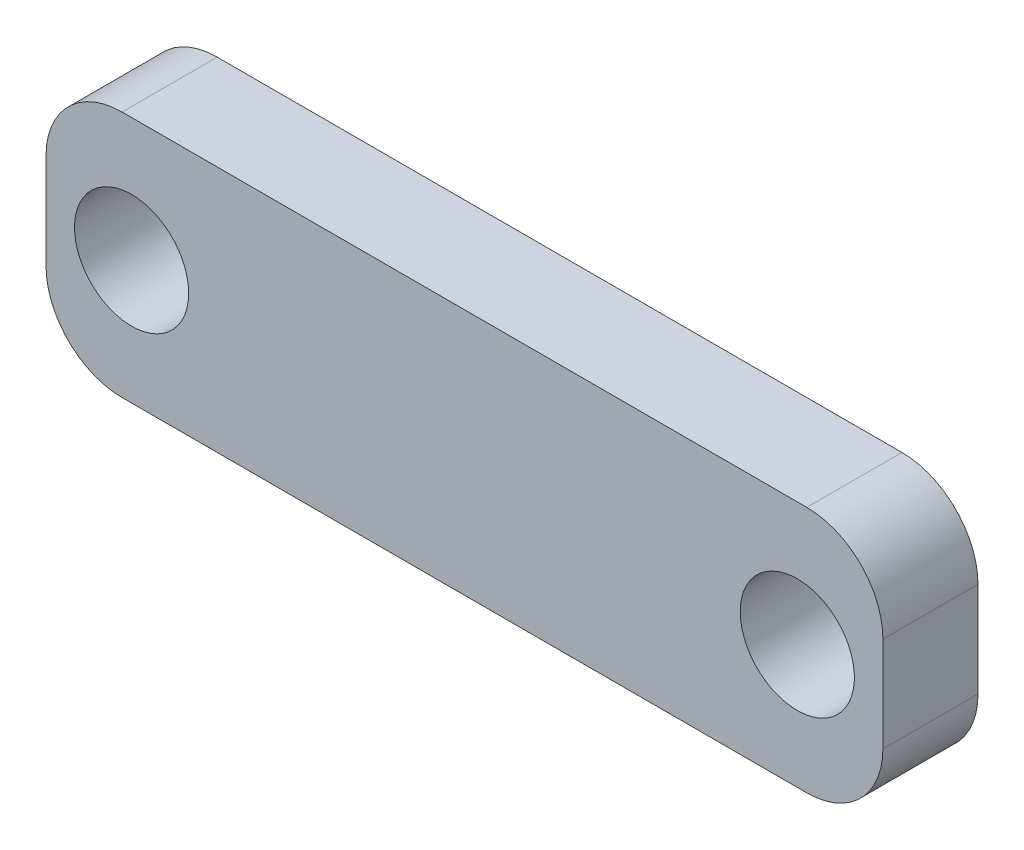
ISO-10303-21;
HEADER;
FILE_DESCRIPTION(('STEP AP214'),'2;1');
FILE_NAME('part.step','',(''),(''),'','','');
FILE_SCHEMA(('AUTOMOTIVE_DESIGN { 1 0 10303 214 1 1 1 1 }'));
ENDSEC;
DATA;
#1=APPLICATION_CONTEXT('core data for automotive mechanical design processes');
#2=APPLICATION_PROTOCOL_DEFINITION('international standard','automotive_design',2000,#1);
#3=PRODUCT_CONTEXT('',#1,'mechanical');
#4=PRODUCT('Part','Part','',(#3));
#5=PRODUCT_RELATED_PRODUCT_CATEGORY('part','',(#4));
#6=PRODUCT_DEFINITION_FORMATION('','',#4);
#7=PRODUCT_DEFINITION_CONTEXT('part definition',#1,'design');
#8=PRODUCT_DEFINITION('design','',#6,#7);
#9=PRODUCT_DEFINITION_SHAPE('','',#8);
#10=(LENGTH_UNIT() NAMED_UNIT(*) SI_UNIT(.MILLI.,.METRE.));
#11=(NAMED_UNIT(*) PLANE_ANGLE_UNIT() SI_UNIT($,.RADIAN.));
#12=(NAMED_UNIT(*) SI_UNIT($,.STERADIAN.) SOLID_ANGLE_UNIT());
#13=UNCERTAINTY_MEASURE_WITH_UNIT(LENGTH_MEASURE(1.E-05),#10,'distance_accuracy_value','');
#14=(GEOMETRIC_REPRESENTATION_CONTEXT(3) GLOBAL_UNCERTAINTY_ASSIGNED_CONTEXT((#13)) GLOBAL_UNIT_ASSIGNED_CONTEXT((#10,
#11,#12)) REPRESENTATION_CONTEXT('',''));
#15=CARTESIAN_POINT('',(0.,0.,0.));
#16=DIRECTION('',(0.,0.,1.));
#17=DIRECTION('',(1.,0.,0.));
#18=AXIS2_PLACEMENT_3D('',#15,#16,#17);
#19=CARTESIAN_POINT('',(0.,0.,2.5));
#20=DIRECTION('',(0.,0.,-1.));
#21=DIRECTION('',(-1.,0.,0.));
#22=AXIS2_PLACEMENT_3D('',#19,#20,#21);
#23=PLANE('',#22);
#24=DIRECTION('',(-1.,0.,0.));
#25=VECTOR('',#24,1.);
#26=CARTESIAN_POINT('',(-11.,3.25,2.5));
#27=LINE('',#26,#25);
#28=CARTESIAN_POINT('',(9.,3.25,2.5));
#29=VERTEX_POINT('',#28);
#30=CARTESIAN_POINT('',(-9.,3.25,2.5));
#31=VERTEX_POINT('',#30);
#32=EDGE_CURVE('E200',#29,#31,#27,.T.);
#33=ORIENTED_EDGE('',*,*,#32,.T.);
#34=CARTESIAN_POINT('',(-9.,1.25,2.5));
#35=DIRECTION('',(0.,0.,-1.));
#36=DIRECTION('',(-1.,0.,0.));
#37=AXIS2_PLACEMENT_3D('',#34,#35,#36);
#38=CIRCLE('',#37,2.);
#39=CARTESIAN_POINT('',(-11.,1.25,2.5));
#40=VERTEX_POINT('',#39);
#41=EDGE_CURVE('E176',#31,#40,#38,.F.);
#42=ORIENTED_EDGE('',*,*,#41,.T.);
#43=DIRECTION('',(0.,-1.,0.));
#44=VECTOR('',#43,1.);
#45=CARTESIAN_POINT('',(-11.,-3.25,2.5));
#46=LINE('',#45,#44);
#47=CARTESIAN_POINT('',(-11.,-1.25,2.5));
#48=VERTEX_POINT('',#47);
#49=EDGE_CURVE('E133',#40,#48,#46,.T.);
#50=ORIENTED_EDGE('',*,*,#49,.T.);
#51=CARTESIAN_POINT('',(-9.,-1.25,2.5));
#52=DIRECTION('',(0.,0.,-1.));
#53=DIRECTION('',(-1.,0.,0.));
#54=AXIS2_PLACEMENT_3D('',#51,#52,#53);
#55=CIRCLE('',#54,2.);
#56=CARTESIAN_POINT('',(-9.,-3.25,2.5));
#57=VERTEX_POINT('',#56);
#58=EDGE_CURVE('E68',#48,#57,#55,.F.);
#59=ORIENTED_EDGE('',*,*,#58,.T.);
#60=DIRECTION('',(1.,0.,0.));
#61=VECTOR('',#60,1.);
#62=CARTESIAN_POINT('',(-11.,-3.25,2.5));
#63=LINE('',#62,#61);
#64=CARTESIAN_POINT('',(9.,-3.25,2.5));
#65=VERTEX_POINT('',#64);
#66=EDGE_CURVE('E154',#57,#65,#63,.T.);
#67=ORIENTED_EDGE('',*,*,#66,.T.);
#68=CARTESIAN_POINT('',(9.,-1.25,2.5));
#69=DIRECTION('',(0.,0.,-1.));
#70=DIRECTION('',(-1.,0.,0.));
#71=AXIS2_PLACEMENT_3D('',#68,#69,#70);
#72=CIRCLE('',#71,2.);
#73=CARTESIAN_POINT('',(11.,-1.25,2.5));
#74=VERTEX_POINT('',#73);
#75=EDGE_CURVE('E171',#65,#74,#72,.F.);
#76=ORIENTED_EDGE('',*,*,#75,.T.);
#77=DIRECTION('',(0.,1.,0.));
#78=VECTOR('',#77,1.);
#79=CARTESIAN_POINT('',(11.,-3.25,2.5));
#80=LINE('',#79,#78);
#81=CARTESIAN_POINT('',(11.,1.25,2.5));
#82=VERTEX_POINT('',#81);
#83=EDGE_CURVE('E147',#74,#82,#80,.T.);
#84=ORIENTED_EDGE('',*,*,#83,.T.);
#85=CARTESIAN_POINT('',(9.,1.25,2.5));
#86=DIRECTION('',(0.,0.,-1.));
#87=DIRECTION('',(-1.,0.,0.));
#88=AXIS2_PLACEMENT_3D('',#85,#86,#87);
#89=CIRCLE('',#88,2.);
#90=EDGE_CURVE('E168',#82,#29,#89,.F.);
#91=ORIENTED_EDGE('',*,*,#90,.T.);
#92=EDGE_LOOP('',(#33,#42,#50,#59,#67,#76,#84,#91));
#93=FACE_BOUND('',#92,.T.);
#94=CARTESIAN_POINT('',(-8.75,0.,2.5));
#95=DIRECTION('',(0.,0.,1.));
#96=DIRECTION('',(1.,0.,0.));
#97=AXIS2_PLACEMENT_3D('',#94,#95,#96);
#98=CIRCLE('',#97,1.5);
#99=CARTESIAN_POINT('',(-7.25,0.,2.5));
#100=VERTEX_POINT('',#99);
#101=EDGE_CURVE('E206',#100,#100,#98,.T.);
#102=ORIENTED_EDGE('',*,*,#101,.F.);
#103=EDGE_LOOP('',(#102));
#104=FACE_BOUND('',#103,.T.);
#105=CARTESIAN_POINT('',(8.75,0.,2.5));
#106=DIRECTION('',(0.,0.,1.));
#107=DIRECTION('',(-1.,0.,0.));
#108=AXIS2_PLACEMENT_3D('',#105,#106,#107);
#109=CIRCLE('',#108,1.5);
#110=CARTESIAN_POINT('',(7.25,0.,2.5));
#111=VERTEX_POINT('',#110);
#112=EDGE_CURVE('E220',#111,#111,#109,.T.);
#113=ORIENTED_EDGE('',*,*,#112,.F.);
#114=EDGE_LOOP('',(#113));
#115=FACE_BOUND('',#114,.T.);
#116=ADVANCED_FACE('F45',(#93,#104,#115),#23,.F.);
#117=CARTESIAN_POINT('',(0.,0.,0.));
#118=DIRECTION('',(0.,0.,-1.));
#119=DIRECTION('',(-1.,0.,0.));
#120=AXIS2_PLACEMENT_3D('',#117,#118,#119);
#121=PLANE('',#120);
#122=CARTESIAN_POINT('',(-8.75,0.,0.));
#123=DIRECTION('',(0.,0.,1.));
#124=DIRECTION('',(1.,0.,0.));
#125=AXIS2_PLACEMENT_3D('',#122,#123,#124);
#126=CIRCLE('',#125,1.5);
#127=CARTESIAN_POINT('',(-7.25,0.,0.));
#128=VERTEX_POINT('',#127);
#129=EDGE_CURVE('E209',#128,#128,#126,.T.);
#130=ORIENTED_EDGE('',*,*,#129,.T.);
#131=EDGE_LOOP('',(#130));
#132=FACE_BOUND('',#131,.T.);
#133=DIRECTION('',(0.,-1.,0.));
#134=VECTOR('',#133,1.);
#135=CARTESIAN_POINT('',(-11.,-3.25,0.));
#136=LINE('',#135,#134);
#137=CARTESIAN_POINT('',(-11.,1.25,0.));
#138=VERTEX_POINT('',#137);
#139=CARTESIAN_POINT('',(-11.,-1.25,0.));
#140=VERTEX_POINT('',#139);
#141=EDGE_CURVE('E131',#138,#140,#136,.T.);
#142=ORIENTED_EDGE('',*,*,#141,.F.);
#143=CARTESIAN_POINT('',(-9.,1.25,0.));
#144=DIRECTION('',(0.,0.,-1.));
#145=DIRECTION('',(-1.,0.,0.));
#146=AXIS2_PLACEMENT_3D('',#143,#144,#145);
#147=CIRCLE('',#146,2.);
#148=CARTESIAN_POINT('',(-9.,3.25,0.));
#149=VERTEX_POINT('',#148);
#150=EDGE_CURVE('E113',#138,#149,#147,.T.);
#151=ORIENTED_EDGE('',*,*,#150,.T.);
#152=DIRECTION('',(-1.,0.,0.));
#153=VECTOR('',#152,1.);
#154=CARTESIAN_POINT('',(-11.,3.25,0.));
#155=LINE('',#154,#153);
#156=CARTESIAN_POINT('',(9.,3.25,0.));
#157=VERTEX_POINT('',#156);
#158=EDGE_CURVE('E143',#157,#149,#155,.T.);
#159=ORIENTED_EDGE('',*,*,#158,.F.);
#160=CARTESIAN_POINT('',(9.,1.25,0.));
#161=DIRECTION('',(0.,0.,-1.));
#162=DIRECTION('',(-1.,0.,0.));
#163=AXIS2_PLACEMENT_3D('',#160,#161,#162);
#164=CIRCLE('',#163,2.);
#165=CARTESIAN_POINT('',(11.,1.25,0.));
#166=VERTEX_POINT('',#165);
#167=EDGE_CURVE('E135',#157,#166,#164,.T.);
#168=ORIENTED_EDGE('',*,*,#167,.T.);
#169=DIRECTION('',(0.,1.,0.));
#170=VECTOR('',#169,1.);
#171=CARTESIAN_POINT('',(11.,-3.25,0.));
#172=LINE('',#171,#170);
#173=CARTESIAN_POINT('',(11.,-1.25,0.));
#174=VERTEX_POINT('',#173);
#175=EDGE_CURVE('E149',#174,#166,#172,.T.);
#176=ORIENTED_EDGE('',*,*,#175,.F.);
#177=CARTESIAN_POINT('',(9.,-1.25,0.));
#178=DIRECTION('',(0.,0.,-1.));
#179=DIRECTION('',(-1.,0.,0.));
#180=AXIS2_PLACEMENT_3D('',#177,#178,#179);
#181=CIRCLE('',#180,2.);
#182=CARTESIAN_POINT('',(9.,-3.25,0.));
#183=VERTEX_POINT('',#182);
#184=EDGE_CURVE('E158',#174,#183,#181,.T.);
#185=ORIENTED_EDGE('',*,*,#184,.T.);
#186=DIRECTION('',(1.,0.,0.));
#187=VECTOR('',#186,1.);
#188=CARTESIAN_POINT('',(-11.,-3.25,0.));
#189=LINE('',#188,#187);
#190=CARTESIAN_POINT('',(-9.,-3.25,0.));
#191=VERTEX_POINT('',#190);
#192=EDGE_CURVE('E142',#191,#183,#189,.T.);
#193=ORIENTED_EDGE('',*,*,#192,.F.);
#194=CARTESIAN_POINT('',(-9.,-1.25,0.));
#195=DIRECTION('',(0.,0.,-1.));
#196=DIRECTION('',(-1.,0.,0.));
#197=AXIS2_PLACEMENT_3D('',#194,#195,#196);
#198=CIRCLE('',#197,2.);
#199=EDGE_CURVE('E125',#191,#140,#198,.T.);
#200=ORIENTED_EDGE('',*,*,#199,.T.);
#201=EDGE_LOOP('',(#142,#151,#159,#168,#176,#185,#193,#200));
#202=FACE_BOUND('',#201,.T.);
#203=CARTESIAN_POINT('',(8.75,0.,0.));
#204=DIRECTION('',(0.,0.,1.));
#205=DIRECTION('',(-1.,0.,0.));
#206=AXIS2_PLACEMENT_3D('',#203,#204,#205);
#207=CIRCLE('',#206,1.5);
#208=CARTESIAN_POINT('',(7.25,0.,0.));
#209=VERTEX_POINT('',#208);
#210=EDGE_CURVE('E222',#209,#209,#207,.T.);
#211=ORIENTED_EDGE('',*,*,#210,.T.);
#212=EDGE_LOOP('',(#211));
#213=FACE_BOUND('',#212,.T.);
#214=ADVANCED_FACE('F138',(#132,#202,#213),#121,.T.);
#215=CARTESIAN_POINT('',(11.,-3.25,2.5));
#216=DIRECTION('',(-1.,0.,0.));
#217=DIRECTION('',(0.,0.,1.));
#218=AXIS2_PLACEMENT_3D('',#215,#216,#217);
#219=PLANE('',#218);
#220=ORIENTED_EDGE('',*,*,#83,.F.);
#221=DIRECTION('',(0.,0.,-1.));
#222=VECTOR('',#221,1.);
#223=CARTESIAN_POINT('',(11.,-1.25,2.5));
#224=LINE('',#223,#222);
#225=EDGE_CURVE('E11',#74,#174,#224,.T.);
#226=ORIENTED_EDGE('',*,*,#225,.T.);
#227=ORIENTED_EDGE('',*,*,#175,.T.);
#228=DIRECTION('',(0.,0.,-1.));
#229=VECTOR('',#228,1.);
#230=CARTESIAN_POINT('',(11.,1.25,2.5));
#231=LINE('',#230,#229);
#232=EDGE_CURVE('E54',#166,#82,#231,.F.);
#233=ORIENTED_EDGE('',*,*,#232,.T.);
#234=EDGE_LOOP('',(#220,#226,#227,#233));
#235=FACE_BOUND('',#234,.T.);
#236=ADVANCED_FACE('F190',(#235),#219,.F.);
#237=CARTESIAN_POINT('',(-11.,3.25,2.5));
#238=DIRECTION('',(0.,-1.,0.));
#239=DIRECTION('',(0.,0.,-1.));
#240=AXIS2_PLACEMENT_3D('',#237,#238,#239);
#241=PLANE('',#240);
#242=ORIENTED_EDGE('',*,*,#158,.T.);
#243=DIRECTION('',(0.,0.,-1.));
#244=VECTOR('',#243,1.);
#245=CARTESIAN_POINT('',(-9.,3.25,2.5));
#246=LINE('',#245,#244);
#247=EDGE_CURVE('E118',#149,#31,#246,.F.);
#248=ORIENTED_EDGE('',*,*,#247,.T.);
#249=ORIENTED_EDGE('',*,*,#32,.F.);
#250=DIRECTION('',(0.,0.,-1.));
#251=VECTOR('',#250,1.);
#252=CARTESIAN_POINT('',(9.,3.25,2.5));
#253=LINE('',#252,#251);
#254=EDGE_CURVE('E124',#29,#157,#253,.T.);
#255=ORIENTED_EDGE('',*,*,#254,.T.);
#256=EDGE_LOOP('',(#242,#248,#249,#255));
#257=FACE_BOUND('',#256,.T.);
#258=ADVANCED_FACE('F204',(#257),#241,.F.);
#259=CARTESIAN_POINT('',(-11.,-3.25,2.5));
#260=DIRECTION('',(1.,0.,0.));
#261=DIRECTION('',(0.,0.,-1.));
#262=AXIS2_PLACEMENT_3D('',#259,#260,#261);
#263=PLANE('',#262);
#264=ORIENTED_EDGE('',*,*,#49,.F.);
#265=DIRECTION('',(0.,0.,-1.));
#266=VECTOR('',#265,1.);
#267=CARTESIAN_POINT('',(-11.,1.25,2.5));
#268=LINE('',#267,#266);
#269=EDGE_CURVE('E117',#40,#138,#268,.T.);
#270=ORIENTED_EDGE('',*,*,#269,.T.);
#271=ORIENTED_EDGE('',*,*,#141,.T.);
#272=DIRECTION('',(0.,0.,-1.));
#273=VECTOR('',#272,1.);
#274=CARTESIAN_POINT('',(-11.,-1.25,2.5));
#275=LINE('',#274,#273);
#276=EDGE_CURVE('E136',#140,#48,#275,.F.);
#277=ORIENTED_EDGE('',*,*,#276,.T.);
#278=EDGE_LOOP('',(#264,#270,#271,#277));
#279=FACE_BOUND('',#278,.T.);
#280=ADVANCED_FACE('F130',(#279),#263,.F.);
#281=CARTESIAN_POINT('',(-11.,-3.25,2.5));
#282=DIRECTION('',(0.,1.,0.));
#283=DIRECTION('',(0.,0.,1.));
#284=AXIS2_PLACEMENT_3D('',#281,#282,#283);
#285=PLANE('',#284);
#286=ORIENTED_EDGE('',*,*,#66,.F.);
#287=DIRECTION('',(0.,0.,-1.));
#288=VECTOR('',#287,1.);
#289=CARTESIAN_POINT('',(-9.,-3.25,2.5));
#290=LINE('',#289,#288);
#291=EDGE_CURVE('E181',#57,#191,#290,.T.);
#292=ORIENTED_EDGE('',*,*,#291,.T.);
#293=ORIENTED_EDGE('',*,*,#192,.T.);
#294=DIRECTION('',(0.,0.,-1.));
#295=VECTOR('',#294,1.);
#296=CARTESIAN_POINT('',(9.,-3.25,2.5));
#297=LINE('',#296,#295);
#298=EDGE_CURVE('E61',#183,#65,#297,.F.);
#299=ORIENTED_EDGE('',*,*,#298,.T.);
#300=EDGE_LOOP('',(#286,#292,#293,#299));
#301=FACE_BOUND('',#300,.T.);
#302=ADVANCED_FACE('F245',(#301),#285,.F.);
#303=CARTESIAN_POINT('',(-8.75,0.,2.5));
#304=DIRECTION('',(0.,0.,-1.));
#305=DIRECTION('',(-1.,0.,0.));
#306=AXIS2_PLACEMENT_3D('',#303,#304,#305);
#307=CYLINDRICAL_SURFACE('',#306,1.5);
#308=ORIENTED_EDGE('',*,*,#101,.T.);
#309=EDGE_LOOP('',(#308));
#310=FACE_BOUND('',#309,.T.);
#311=ORIENTED_EDGE('',*,*,#129,.F.);
#312=EDGE_LOOP('',(#311));
#313=FACE_BOUND('',#312,.T.);
#314=ADVANCED_FACE('F242',(#310,#313),#307,.F.);
#315=CARTESIAN_POINT('',(8.75,0.,2.5));
#316=DIRECTION('',(0.,0.,-1.));
#317=DIRECTION('',(-1.,0.,0.));
#318=AXIS2_PLACEMENT_3D('',#315,#316,#317);
#319=CYLINDRICAL_SURFACE('',#318,1.5);
#320=ORIENTED_EDGE('',*,*,#112,.T.);
#321=EDGE_LOOP('',(#320));
#322=FACE_BOUND('',#321,.T.);
#323=ORIENTED_EDGE('',*,*,#210,.F.);
#324=EDGE_LOOP('',(#323));
#325=FACE_BOUND('',#324,.T.);
#326=ADVANCED_FACE('F230',(#322,#325),#319,.F.);
#327=CARTESIAN_POINT('',(-9.,1.25,2.5));
#328=DIRECTION('',(0.,0.,-1.));
#329=DIRECTION('',(-1.,0.,0.));
#330=AXIS2_PLACEMENT_3D('',#327,#328,#329);
#331=CYLINDRICAL_SURFACE('',#330,2.);
#332=ORIENTED_EDGE('',*,*,#41,.F.);
#333=ORIENTED_EDGE('',*,*,#247,.F.);
#334=ORIENTED_EDGE('',*,*,#150,.F.);
#335=ORIENTED_EDGE('',*,*,#269,.F.);
#336=EDGE_LOOP('',(#332,#333,#334,#335));
#337=FACE_BOUND('',#336,.T.);
#338=ADVANCED_FACE('F116',(#337),#331,.T.);
#339=CARTESIAN_POINT('',(-9.,-1.25,2.5));
#340=DIRECTION('',(0.,0.,-1.));
#341=DIRECTION('',(-1.,0.,0.));
#342=AXIS2_PLACEMENT_3D('',#339,#340,#341);
#343=CYLINDRICAL_SURFACE('',#342,2.);
#344=ORIENTED_EDGE('',*,*,#58,.F.);
#345=ORIENTED_EDGE('',*,*,#276,.F.);
#346=ORIENTED_EDGE('',*,*,#199,.F.);
#347=ORIENTED_EDGE('',*,*,#291,.F.);
#348=EDGE_LOOP('',(#344,#345,#346,#347));
#349=FACE_BOUND('',#348,.T.);
#350=ADVANCED_FACE('F256',(#349),#343,.T.);
#351=CARTESIAN_POINT('',(9.,-1.25,2.5));
#352=DIRECTION('',(0.,0.,-1.));
#353=DIRECTION('',(-1.,0.,0.));
#354=AXIS2_PLACEMENT_3D('',#351,#352,#353);
#355=CYLINDRICAL_SURFACE('',#354,2.);
#356=ORIENTED_EDGE('',*,*,#75,.F.);
#357=ORIENTED_EDGE('',*,*,#298,.F.);
#358=ORIENTED_EDGE('',*,*,#184,.F.);
#359=ORIENTED_EDGE('',*,*,#225,.F.);
#360=EDGE_LOOP('',(#356,#357,#358,#359));
#361=FACE_BOUND('',#360,.T.);
#362=ADVANCED_FACE('F258',(#361),#355,.T.);
#363=CARTESIAN_POINT('',(9.,1.25,2.5));
#364=DIRECTION('',(0.,0.,-1.));
#365=DIRECTION('',(-1.,0.,0.));
#366=AXIS2_PLACEMENT_3D('',#363,#364,#365);
#367=CYLINDRICAL_SURFACE('',#366,2.);
#368=ORIENTED_EDGE('',*,*,#90,.F.);
#369=ORIENTED_EDGE('',*,*,#232,.F.);
#370=ORIENTED_EDGE('',*,*,#167,.F.);
#371=ORIENTED_EDGE('',*,*,#254,.F.);
#372=EDGE_LOOP('',(#368,#369,#370,#371));
#373=FACE_BOUND('',#372,.T.);
#374=ADVANCED_FACE('F47',(#373),#367,.T.);
#375=CLOSED_SHELL('',(#116,#214,#236,#258,#280,#302,#314,#326,#338,#350,#362,#374));
#376=MANIFOLD_SOLID_BREP('B2',#375);
#377=ADVANCED_BREP_SHAPE_REPRESENTATION('',(#18,#376),#14);
#378=SHAPE_DEFINITION_REPRESENTATION(#9,#377);
ENDSEC;
END-ISO-10303-21;
